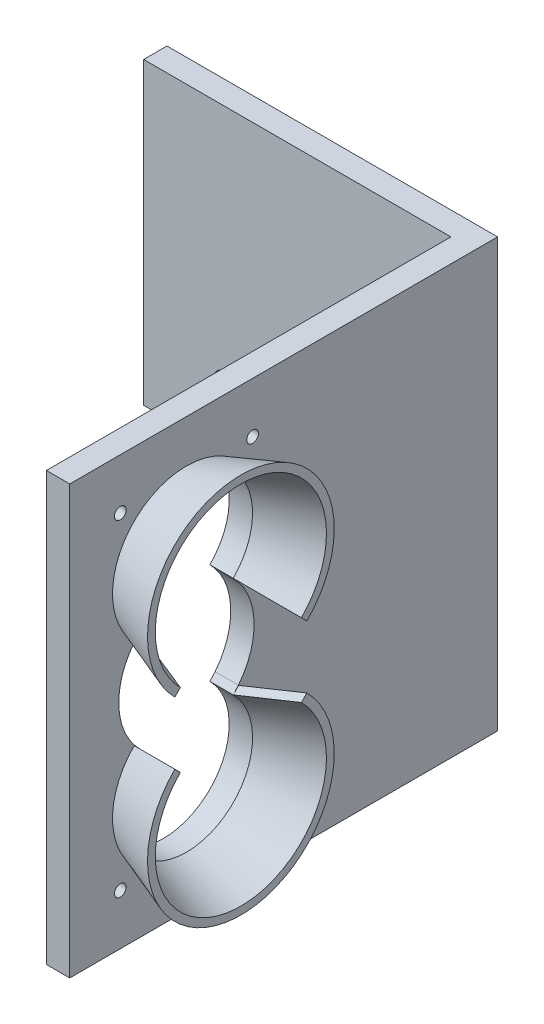
ISO-10303-21;
HEADER;
FILE_DESCRIPTION(('STEP AP214'),'2;1');
FILE_NAME('part.step','',(''),(''),'','','');
FILE_SCHEMA(('AUTOMOTIVE_DESIGN { 1 0 10303 214 1 1 1 1 }'));
ENDSEC;
DATA;
#1=APPLICATION_CONTEXT('core data for automotive mechanical design processes');
#2=APPLICATION_PROTOCOL_DEFINITION('international standard','automotive_design',2000,#1);
#3=PRODUCT_CONTEXT('',#1,'mechanical');
#4=PRODUCT('Part','Part','',(#3));
#5=PRODUCT_RELATED_PRODUCT_CATEGORY('part','',(#4));
#6=PRODUCT_DEFINITION_FORMATION('','',#4);
#7=PRODUCT_DEFINITION_CONTEXT('part definition',#1,'design');
#8=PRODUCT_DEFINITION('design','',#6,#7);
#9=PRODUCT_DEFINITION_SHAPE('','',#8);
#10=(LENGTH_UNIT() NAMED_UNIT(*) SI_UNIT(.MILLI.,.METRE.));
#11=(NAMED_UNIT(*) PLANE_ANGLE_UNIT() SI_UNIT($,.RADIAN.));
#12=(NAMED_UNIT(*) SI_UNIT($,.STERADIAN.) SOLID_ANGLE_UNIT());
#13=UNCERTAINTY_MEASURE_WITH_UNIT(LENGTH_MEASURE(1.E-05),#10,'distance_accuracy_value','');
#14=(GEOMETRIC_REPRESENTATION_CONTEXT(3) GLOBAL_UNCERTAINTY_ASSIGNED_CONTEXT((#13)) GLOBAL_UNIT_ASSIGNED_CONTEXT((#10,
#11,#12)) REPRESENTATION_CONTEXT('',''));
#15=CARTESIAN_POINT('',(0.,0.,0.));
#16=DIRECTION('',(0.,0.,1.));
#17=DIRECTION('',(1.,0.,0.));
#18=AXIS2_PLACEMENT_3D('',#15,#16,#17);
#19=CARTESIAN_POINT('',(25.8823529411765,27.5,-27.2843137254902));
#20=DIRECTION('',(-1.,0.,0.));
#21=DIRECTION('',(0.,0.,1.));
#22=AXIS2_PLACEMENT_3D('',#19,#20,#21);
#23=PLANE('',#22);
#24=CARTESIAN_POINT('',(25.8823529411765,21.,21.2156862745098));
#25=DIRECTION('',(1.,0.,0.));
#26=DIRECTION('',(0.,0.,-1.));
#27=AXIS2_PLACEMENT_3D('',#24,#25,#26);
#28=CIRCLE('',#27,0.750000000000002);
#29=CARTESIAN_POINT('',(25.8823529411765,21.,20.4656862745098));
#30=VERTEX_POINT('',#29);
#31=EDGE_CURVE('E521',#30,#30,#28,.T.);
#32=ORIENTED_EDGE('',*,*,#31,.F.);
#33=EDGE_LOOP('',(#32));
#34=FACE_BOUND('',#33,.T.);
#35=CARTESIAN_POINT('',(25.8823529411765,21.,4.2156862745098));
#36=DIRECTION('',(1.,0.,0.));
#37=DIRECTION('',(0.,0.,-1.));
#38=AXIS2_PLACEMENT_3D('',#35,#36,#37);
#39=CIRCLE('',#38,0.75);
#40=CARTESIAN_POINT('',(25.8823529411765,21.,3.4656862745098));
#41=VERTEX_POINT('',#40);
#42=EDGE_CURVE('E500',#41,#41,#39,.F.);
#43=ORIENTED_EDGE('',*,*,#42,.T.);
#44=EDGE_LOOP('',(#43));
#45=FACE_BOUND('',#44,.T.);
#46=CARTESIAN_POINT('',(25.8823529411765,-21.,21.2156862745098));
#47=DIRECTION('',(1.,0.,0.));
#48=DIRECTION('',(0.,0.,-1.));
#49=AXIS2_PLACEMENT_3D('',#46,#47,#48);
#50=CIRCLE('',#49,0.750000000000002);
#51=CARTESIAN_POINT('',(25.8823529411765,-21.,20.4656862745098));
#52=VERTEX_POINT('',#51);
#53=EDGE_CURVE('E336',#52,#52,#50,.F.);
#54=ORIENTED_EDGE('',*,*,#53,.T.);
#55=EDGE_LOOP('',(#54));
#56=FACE_BOUND('',#55,.T.);
#57=DIRECTION('',(0.,0.,-1.));
#58=VECTOR('',#57,1.);
#59=CARTESIAN_POINT('',(25.8823529411765,-27.5,-27.2843137254902));
#60=LINE('',#59,#58);
#61=CARTESIAN_POINT('',(25.8823529411765,-27.5,27.7156862745098));
#62=VERTEX_POINT('',#61);
#63=CARTESIAN_POINT('',(25.8823529411765,-27.5,-27.2843137254902));
#64=VERTEX_POINT('',#63);
#65=EDGE_CURVE('E333',#62,#64,#60,.T.);
#66=ORIENTED_EDGE('',*,*,#65,.T.);
#67=DIRECTION('',(0.,-1.,0.));
#68=VECTOR('',#67,1.);
#69=CARTESIAN_POINT('',(25.8823529411765,27.5,-27.2843137254902));
#70=LINE('',#69,#68);
#71=CARTESIAN_POINT('',(25.8823529411765,27.5,-27.2843137254902));
#72=VERTEX_POINT('',#71);
#73=EDGE_CURVE('E354',#72,#64,#70,.T.);
#74=ORIENTED_EDGE('',*,*,#73,.F.);
#75=DIRECTION('',(0.,0.,-1.));
#76=VECTOR('',#75,1.);
#77=CARTESIAN_POINT('',(25.8823529411765,27.5,-27.2843137254902));
#78=LINE('',#77,#76);
#79=CARTESIAN_POINT('',(25.8823529411765,27.5,27.7156862745098));
#80=VERTEX_POINT('',#79);
#81=EDGE_CURVE('E342',#80,#72,#78,.T.);
#82=ORIENTED_EDGE('',*,*,#81,.F.);
#83=DIRECTION('',(0.,-1.,0.));
#84=VECTOR('',#83,1.);
#85=CARTESIAN_POINT('',(25.8823529411765,27.5,27.7156862745098));
#86=LINE('',#85,#84);
#87=EDGE_CURVE('E357',#80,#62,#86,.T.);
#88=ORIENTED_EDGE('',*,*,#87,.T.);
#89=EDGE_LOOP('',(#66,#74,#82,#88));
#90=FACE_BOUND('',#89,.T.);
#91=CARTESIAN_POINT('',(25.8823529411765,-21.,4.2156862745098));
#92=DIRECTION('',(1.,0.,0.));
#93=DIRECTION('',(0.,0.,-1.));
#94=AXIS2_PLACEMENT_3D('',#91,#92,#93);
#95=CIRCLE('',#94,0.75);
#96=CARTESIAN_POINT('',(25.8823529411765,-21.,3.4656862745098));
#97=VERTEX_POINT('',#96);
#98=EDGE_CURVE('E527',#97,#97,#95,.T.);
#99=ORIENTED_EDGE('',*,*,#98,.F.);
#100=EDGE_LOOP('',(#99));
#101=FACE_BOUND('',#100,.T.);
#102=CARTESIAN_POINT('',(25.8823529411765,-12.5,12.7156862745098));
#103=DIRECTION('',(-1.,0.,0.));
#104=DIRECTION('',(0.,-1.,0.));
#105=AXIS2_PLACEMENT_3D('',#102,#103,#104);
#106=CIRCLE('',#105,9.5);
#107=CARTESIAN_POINT('',(25.8823529411765,-5.78248557872775,5.99817185323764));
#108=VERTEX_POINT('',#107);
#109=CARTESIAN_POINT('',(25.8823529411765,-5.78248557872776,19.433200695782));
#110=VERTEX_POINT('',#109);
#111=EDGE_CURVE('E435',#108,#110,#106,.T.);
#112=ORIENTED_EDGE('',*,*,#111,.T.);
#113=DIRECTION('',(0.,0.707106781186551,0.707106781186544));
#114=VECTOR('',#113,1.);
#115=CARTESIAN_POINT('',(25.8823529411765,-21.3388347648319,3.87685150967801));
#116=LINE('',#115,#114);
#117=CARTESIAN_POINT('',(25.8823529411765,-6.48959235991431,18.7260939145954));
#118=VERTEX_POINT('',#117);
#119=EDGE_CURVE('E395',#118,#110,#116,.T.);
#120=ORIENTED_EDGE('',*,*,#119,.F.);
#121=DIRECTION('',(0.,0.744628434388798,0.667479209189086));
#122=VECTOR('',#121,1.);
#123=CARTESIAN_POINT('',(25.8823529411765,-12.1986163895243,13.6085686247462));
#124=LINE('',#123,#122);
#125=CARTESIAN_POINT('',(25.8823529411765,-5.74397055779098,19.3944635709919));
#126=VERTEX_POINT('',#125);
#127=EDGE_CURVE('E454',#118,#126,#124,.T.);
#128=ORIENTED_EDGE('',*,*,#127,.T.);
#129=CARTESIAN_POINT('',(25.8823529411765,1.196959198424E-13,12.236501554681));
#130=DIRECTION('',(1.,0.,0.));
#131=DIRECTION('',(0.,0.,-1.));
#132=AXIS2_PLACEMENT_3D('',#129,#130,#131);
#133=CIRCLE('',#132,9.17766952966388);
#134=CARTESIAN_POINT('',(25.8823529411765,5.74397055779107,19.394463570992));
#135=VERTEX_POINT('',#134);
#136=EDGE_CURVE('E458',#135,#126,#133,.T.);
#137=ORIENTED_EDGE('',*,*,#136,.F.);
#138=DIRECTION('',(0.,-0.744628434388801,0.667479209189083));
#139=VECTOR('',#138,1.);
#140=CARTESIAN_POINT('',(25.8823529411765,12.1986163895244,13.6085686247464));
#141=LINE('',#140,#139);
#142=CARTESIAN_POINT('',(25.8823529411765,6.48959235991446,18.7260939145956));
#143=VERTEX_POINT('',#142);
#144=EDGE_CURVE('E493',#143,#135,#141,.T.);
#145=ORIENTED_EDGE('',*,*,#144,.F.);
#146=DIRECTION('',(0.,-0.707106781186551,0.707106781186544));
#147=VECTOR('',#146,1.);
#148=CARTESIAN_POINT('',(25.8823529411765,21.3388347648319,3.87685150967803));
#149=LINE('',#148,#147);
#150=CARTESIAN_POINT('',(25.8823529411765,5.78248557872775,19.433200695782));
#151=VERTEX_POINT('',#150);
#152=EDGE_CURVE('E411',#143,#151,#149,.T.);
#153=ORIENTED_EDGE('',*,*,#152,.T.);
#154=CARTESIAN_POINT('',(25.8823529411765,12.5,12.7156862745098));
#155=DIRECTION('',(1.,0.,0.));
#156=DIRECTION('',(0.,1.,0.));
#157=AXIS2_PLACEMENT_3D('',#154,#155,#156);
#158=CIRCLE('',#157,9.5);
#159=CARTESIAN_POINT('',(25.8823529411765,5.78248557872775,5.99817185323764));
#160=VERTEX_POINT('',#159);
#161=EDGE_CURVE('E172',#160,#151,#158,.T.);
#162=ORIENTED_EDGE('',*,*,#161,.F.);
#163=DIRECTION('',(0.,-0.707106781186551,-0.707106781186544));
#164=VECTOR('',#163,1.);
#165=CARTESIAN_POINT('',(25.8823529411765,21.3388347648319,21.5545210393416));
#166=LINE('',#165,#164);
#167=CARTESIAN_POINT('',(25.8823529411765,6.48959235991431,6.70527863442419));
#168=VERTEX_POINT('',#167);
#169=EDGE_CURVE('E437',#168,#160,#166,.T.);
#170=ORIENTED_EDGE('',*,*,#169,.F.);
#171=DIRECTION('',(0.,-0.744628434388708,-0.667479209189186));
#172=VECTOR('',#171,1.);
#173=CARTESIAN_POINT('',(25.8823529411765,-0.441386082781654,0.492402794361063));
#174=LINE('',#173,#172);
#175=CARTESIAN_POINT('',(25.8823529411765,5.74397055779077,6.03690897802791));
#176=VERTEX_POINT('',#175);
#177=EDGE_CURVE('E488',#168,#176,#174,.T.);
#178=ORIENTED_EDGE('',*,*,#177,.T.);
#179=CARTESIAN_POINT('',(25.8823529411765,0.,13.1948709943384));
#180=DIRECTION('',(1.,0.,0.));
#181=DIRECTION('',(0.,0.,-1.));
#182=AXIS2_PLACEMENT_3D('',#179,#180,#181);
#183=CIRCLE('',#182,9.17766952966349);
#184=CARTESIAN_POINT('',(25.8823529411765,-5.74397055779096,6.03690897802772));
#185=VERTEX_POINT('',#184);
#186=EDGE_CURVE('E485',#176,#185,#183,.F.);
#187=ORIENTED_EDGE('',*,*,#186,.T.);
#188=DIRECTION('',(0.,0.744628434388815,-0.667479209189067));
#189=VECTOR('',#188,1.);
#190=CARTESIAN_POINT('',(25.8823529411765,0.441386082782281,0.49240279436192));
#191=LINE('',#190,#189);
#192=CARTESIAN_POINT('',(25.8823529411765,-6.48959235991435,6.70527863442414));
#193=VERTEX_POINT('',#192);
#194=EDGE_CURVE('E482',#193,#185,#191,.T.);
#195=ORIENTED_EDGE('',*,*,#194,.F.);
#196=DIRECTION('',(0.,0.707106781186551,-0.707106781186544));
#197=VECTOR('',#196,1.);
#198=CARTESIAN_POINT('',(25.8823529411765,-21.3388347648319,21.5545210393416));
#199=LINE('',#198,#197);
#200=EDGE_CURVE('E421',#193,#108,#199,.T.);
#201=ORIENTED_EDGE('',*,*,#200,.T.);
#202=EDGE_LOOP('',(#112,#120,#128,#137,#145,#153,#162,#170,#178,#187,#195,#201));
#203=FACE_BOUND('',#202,.T.);
#204=ADVANCED_FACE('F149',(#34,#45,#56,#90,#101,#203),#23,.F.);
#205=CARTESIAN_POINT('',(22.8823529411765,27.5,27.7156862745098));
#206=DIRECTION('',(1.,0.,0.));
#207=DIRECTION('',(0.,0.,-1.));
#208=AXIS2_PLACEMENT_3D('',#205,#206,#207);
#209=PLANE('',#208);
#210=CARTESIAN_POINT('',(22.8823529411765,21.,21.2156862745098));
#211=DIRECTION('',(1.,0.,0.));
#212=DIRECTION('',(0.,0.,-1.));
#213=AXIS2_PLACEMENT_3D('',#210,#211,#212);
#214=CIRCLE('',#213,0.750000000000002);
#215=CARTESIAN_POINT('',(22.8823529411765,21.,20.4656862745098));
#216=VERTEX_POINT('',#215);
#217=EDGE_CURVE('E530',#216,#216,#214,.T.);
#218=ORIENTED_EDGE('',*,*,#217,.T.);
#219=EDGE_LOOP('',(#218));
#220=FACE_BOUND('',#219,.T.);
#221=DIRECTION('',(0.,0.744628434388798,0.667479209189086));
#222=VECTOR('',#221,1.);
#223=CARTESIAN_POINT('',(22.8823529411765,-12.1986163895243,13.6085686247462));
#224=LINE('',#223,#222);
#225=CARTESIAN_POINT('',(22.8823529411765,-6.48959235991436,18.7260939145955));
#226=VERTEX_POINT('',#225);
#227=CARTESIAN_POINT('',(22.8823529411765,-5.74397055779098,19.3944635709919));
#228=VERTEX_POINT('',#227);
#229=EDGE_CURVE('E455',#226,#228,#224,.T.);
#230=ORIENTED_EDGE('',*,*,#229,.F.);
#231=CARTESIAN_POINT('',(22.8823529411765,-12.5,12.7156862745098));
#232=DIRECTION('',(1.,0.,0.));
#233=DIRECTION('',(0.,0.,-1.));
#234=AXIS2_PLACEMENT_3D('',#231,#232,#233);
#235=CIRCLE('',#234,8.5);
#236=CARTESIAN_POINT('',(22.8823529411765,-6.48959235991435,6.70527863442414));
#237=VERTEX_POINT('',#236);
#238=EDGE_CURVE('E457',#226,#237,#235,.T.);
#239=ORIENTED_EDGE('',*,*,#238,.T.);
#240=DIRECTION('',(0.,0.744628434388815,-0.667479209189067));
#241=VECTOR('',#240,1.);
#242=CARTESIAN_POINT('',(22.8823529411765,0.441386082782281,0.49240279436192));
#243=LINE('',#242,#241);
#244=CARTESIAN_POINT('',(22.8823529411765,-5.74397055779096,6.03690897802772));
#245=VERTEX_POINT('',#244);
#246=EDGE_CURVE('E461',#237,#245,#243,.T.);
#247=ORIENTED_EDGE('',*,*,#246,.T.);
#248=CARTESIAN_POINT('',(22.8823529411765,0.,13.1948709943384));
#249=DIRECTION('',(1.,0.,0.));
#250=DIRECTION('',(0.,0.,-1.));
#251=AXIS2_PLACEMENT_3D('',#248,#249,#250);
#252=CIRCLE('',#251,9.17766952966349);
#253=CARTESIAN_POINT('',(22.8823529411765,5.74397055779077,6.03690897802791));
#254=VERTEX_POINT('',#253);
#255=EDGE_CURVE('E464',#254,#245,#252,.F.);
#256=ORIENTED_EDGE('',*,*,#255,.F.);
#257=DIRECTION('',(0.,-0.744628434388708,-0.667479209189186));
#258=VECTOR('',#257,1.);
#259=CARTESIAN_POINT('',(22.8823529411765,-0.441386082781654,0.492402794361063));
#260=LINE('',#259,#258);
#261=CARTESIAN_POINT('',(22.8823529411765,6.48959235991406,6.70527863442445));
#262=VERTEX_POINT('',#261);
#263=EDGE_CURVE('E466',#262,#254,#260,.T.);
#264=ORIENTED_EDGE('',*,*,#263,.F.);
#265=CARTESIAN_POINT('',(22.8823529411765,12.5,12.7156862745098));
#266=DIRECTION('',(1.,0.,0.));
#267=DIRECTION('',(0.,0.,-1.));
#268=AXIS2_PLACEMENT_3D('',#265,#266,#267);
#269=CIRCLE('',#268,8.5);
#270=CARTESIAN_POINT('',(22.8823529411765,6.48959235991446,18.7260939145956));
#271=VERTEX_POINT('',#270);
#272=EDGE_CURVE('E468',#262,#271,#269,.T.);
#273=ORIENTED_EDGE('',*,*,#272,.T.);
#274=DIRECTION('',(0.,-0.744628434388801,0.667479209189083));
#275=VECTOR('',#274,1.);
#276=CARTESIAN_POINT('',(22.8823529411765,12.1986163895244,13.6085686247464));
#277=LINE('',#276,#275);
#278=CARTESIAN_POINT('',(22.8823529411765,5.74397055779107,19.394463570992));
#279=VERTEX_POINT('',#278);
#280=EDGE_CURVE('E471',#271,#279,#277,.T.);
#281=ORIENTED_EDGE('',*,*,#280,.T.);
#282=CARTESIAN_POINT('',(22.8823529411765,1.196959198424E-13,12.236501554681));
#283=DIRECTION('',(1.,0.,0.));
#284=DIRECTION('',(0.,0.,-1.));
#285=AXIS2_PLACEMENT_3D('',#282,#283,#284);
#286=CIRCLE('',#285,9.17766952966388);
#287=EDGE_CURVE('E474',#279,#228,#286,.T.);
#288=ORIENTED_EDGE('',*,*,#287,.T.);
#289=EDGE_LOOP('',(#230,#239,#247,#256,#264,#273,#281,#288));
#290=FACE_BOUND('',#289,.T.);
#291=CARTESIAN_POINT('',(22.8823529411765,21.,4.2156862745098));
#292=DIRECTION('',(1.,0.,0.));
#293=DIRECTION('',(0.,0.,-1.));
#294=AXIS2_PLACEMENT_3D('',#291,#292,#293);
#295=CIRCLE('',#294,0.75);
#296=CARTESIAN_POINT('',(22.8823529411765,21.,3.4656862745098));
#297=VERTEX_POINT('',#296);
#298=EDGE_CURVE('E518',#297,#297,#295,.F.);
#299=ORIENTED_EDGE('',*,*,#298,.F.);
#300=EDGE_LOOP('',(#299));
#301=FACE_BOUND('',#300,.T.);
#302=CARTESIAN_POINT('',(22.8823529411765,-21.,21.2156862745098));
#303=DIRECTION('',(1.,0.,0.));
#304=DIRECTION('',(0.,0.,-1.));
#305=AXIS2_PLACEMENT_3D('',#302,#303,#304);
#306=CIRCLE('',#305,0.750000000000002);
#307=CARTESIAN_POINT('',(22.8823529411765,-21.,20.4656862745098));
#308=VERTEX_POINT('',#307);
#309=EDGE_CURVE('E348',#308,#308,#306,.F.);
#310=ORIENTED_EDGE('',*,*,#309,.F.);
#311=EDGE_LOOP('',(#310));
#312=FACE_BOUND('',#311,.T.);
#313=DIRECTION('',(0.,0.,1.));
#314=VECTOR('',#313,1.);
#315=CARTESIAN_POINT('',(22.8823529411765,-27.5,27.7156862745098));
#316=LINE('',#315,#314);
#317=CARTESIAN_POINT('',(22.8823529411765,-27.5,-24.2843137254902));
#318=VERTEX_POINT('',#317);
#319=CARTESIAN_POINT('',(22.8823529411765,-27.5,27.7156862745098));
#320=VERTEX_POINT('',#319);
#321=EDGE_CURVE('E347',#318,#320,#316,.T.);
#322=ORIENTED_EDGE('',*,*,#321,.T.);
#323=DIRECTION('',(0.,-1.,0.));
#324=VECTOR('',#323,1.);
#325=CARTESIAN_POINT('',(22.8823529411765,27.5,27.7156862745098));
#326=LINE('',#325,#324);
#327=CARTESIAN_POINT('',(22.8823529411765,27.5,27.7156862745098));
#328=VERTEX_POINT('',#327);
#329=EDGE_CURVE('E360',#328,#320,#326,.T.);
#330=ORIENTED_EDGE('',*,*,#329,.F.);
#331=DIRECTION('',(0.,0.,1.));
#332=VECTOR('',#331,1.);
#333=CARTESIAN_POINT('',(22.8823529411765,27.5,27.7156862745098));
#334=LINE('',#333,#332);
#335=CARTESIAN_POINT('',(22.8823529411765,27.5,-24.2843137254902));
#336=VERTEX_POINT('',#335);
#337=EDGE_CURVE('E324',#336,#328,#334,.T.);
#338=ORIENTED_EDGE('',*,*,#337,.F.);
#339=DIRECTION('',(0.,-1.,0.));
#340=VECTOR('',#339,1.);
#341=CARTESIAN_POINT('',(22.8823529411765,27.5,-24.2843137254902));
#342=LINE('',#341,#340);
#343=EDGE_CURVE('E157',#336,#318,#342,.T.);
#344=ORIENTED_EDGE('',*,*,#343,.T.);
#345=EDGE_LOOP('',(#322,#330,#338,#344));
#346=FACE_BOUND('',#345,.T.);
#347=CARTESIAN_POINT('',(22.8823529411765,-21.,4.2156862745098));
#348=DIRECTION('',(1.,0.,0.));
#349=DIRECTION('',(0.,0.,-1.));
#350=AXIS2_PLACEMENT_3D('',#347,#348,#349);
#351=CIRCLE('',#350,0.75);
#352=CARTESIAN_POINT('',(22.8823529411765,-21.,3.4656862745098));
#353=VERTEX_POINT('',#352);
#354=EDGE_CURVE('E524',#353,#353,#351,.T.);
#355=ORIENTED_EDGE('',*,*,#354,.T.);
#356=EDGE_LOOP('',(#355));
#357=FACE_BOUND('',#356,.T.);
#358=ADVANCED_FACE('F364',(#220,#290,#301,#312,#346,#357),#209,.F.);
#359=CARTESIAN_POINT('',(-16.6176470588235,27.5,-24.2843137254902));
#360=DIRECTION('',(1.,0.,0.));
#361=DIRECTION('',(0.,0.,-1.));
#362=AXIS2_PLACEMENT_3D('',#359,#360,#361);
#363=PLANE('',#362);
#364=DIRECTION('',(0.,-1.,0.));
#365=VECTOR('',#364,1.);
#366=CARTESIAN_POINT('',(-16.6176470588235,27.5,-27.2843137254902));
#367=LINE('',#366,#365);
#368=CARTESIAN_POINT('',(-16.6176470588235,27.5,-27.2843137254902));
#369=VERTEX_POINT('',#368);
#370=CARTESIAN_POINT('',(-16.6176470588235,-11.,-27.2843137254902));
#371=VERTEX_POINT('',#370);
#372=EDGE_CURVE('E315',#369,#371,#367,.T.);
#373=ORIENTED_EDGE('',*,*,#372,.T.);
#374=DIRECTION('',(0.,0.,-1.));
#375=VECTOR('',#374,1.);
#376=CARTESIAN_POINT('',(-16.6176470588235,-11.,-24.2843137254902));
#377=LINE('',#376,#375);
#378=CARTESIAN_POINT('',(-16.6176470588235,-11.,-24.2843137254902));
#379=VERTEX_POINT('',#378);
#380=EDGE_CURVE('E302',#379,#371,#377,.T.);
#381=ORIENTED_EDGE('',*,*,#380,.F.);
#382=DIRECTION('',(0.,-1.,0.));
#383=VECTOR('',#382,1.);
#384=CARTESIAN_POINT('',(-16.6176470588235,27.5,-24.2843137254902));
#385=LINE('',#384,#383);
#386=CARTESIAN_POINT('',(-16.6176470588235,27.5,-24.2843137254902));
#387=VERTEX_POINT('',#386);
#388=EDGE_CURVE('E12',#387,#379,#385,.T.);
#389=ORIENTED_EDGE('',*,*,#388,.F.);
#390=DIRECTION('',(0.,0.,1.));
#391=VECTOR('',#390,1.);
#392=CARTESIAN_POINT('',(-16.6176470588235,27.5,-24.2843137254902));
#393=LINE('',#392,#391);
#394=EDGE_CURVE('E325',#369,#387,#393,.T.);
#395=ORIENTED_EDGE('',*,*,#394,.F.);
#396=EDGE_LOOP('',(#373,#381,#389,#395));
#397=FACE_BOUND('',#396,.T.);
#398=ADVANCED_FACE('F151',(#397),#363,.F.);
#399=CARTESIAN_POINT('',(22.8823529411765,27.5,-24.2843137254902));
#400=DIRECTION('',(0.,0.,-1.));
#401=DIRECTION('',(-1.,0.,0.));
#402=AXIS2_PLACEMENT_3D('',#399,#400,#401);
#403=PLANE('',#402);
#404=CARTESIAN_POINT('',(13.8823529411765,-3.5,-24.2843137254902));
#405=DIRECTION('',(0.,0.,-1.));
#406=DIRECTION('',(-1.,0.,0.));
#407=AXIS2_PLACEMENT_3D('',#404,#405,#406);
#408=CIRCLE('',#407,1.5);
#409=CARTESIAN_POINT('',(12.3823529411765,-3.5,-24.2843137254902));
#410=VERTEX_POINT('',#409);
#411=EDGE_CURVE('E399',#410,#410,#408,.T.);
#412=ORIENTED_EDGE('',*,*,#411,.T.);
#413=EDGE_LOOP('',(#412));
#414=FACE_BOUND('',#413,.T.);
#415=CARTESIAN_POINT('',(-6.11764705882352,-3.5,-24.2843137254902));
#416=DIRECTION('',(0.,0.,-1.));
#417=DIRECTION('',(-1.,0.,0.));
#418=AXIS2_PLACEMENT_3D('',#415,#416,#417);
#419=CIRCLE('',#418,1.5);
#420=CARTESIAN_POINT('',(-7.61764705882352,-3.5,-24.2843137254902));
#421=VERTEX_POINT('',#420);
#422=EDGE_CURVE('E392',#421,#421,#419,.T.);
#423=ORIENTED_EDGE('',*,*,#422,.T.);
#424=EDGE_LOOP('',(#423));
#425=FACE_BOUND('',#424,.T.);
#426=DIRECTION('',(1.,0.,0.));
#427=VECTOR('',#426,1.);
#428=CARTESIAN_POINT('',(0.,-11.,-24.2843137254902));
#429=LINE('',#428,#427);
#430=CARTESIAN_POINT('',(3.38235294117648,-11.,-24.2843137254902));
#431=VERTEX_POINT('',#430);
#432=EDGE_CURVE('E298',#379,#431,#429,.T.);
#433=ORIENTED_EDGE('',*,*,#432,.T.);
#434=DIRECTION('',(0.,-1.,0.));
#435=VECTOR('',#434,1.);
#436=CARTESIAN_POINT('',(3.38235294117649,0.,-24.2843137254902));
#437=LINE('',#436,#435);
#438=CARTESIAN_POINT('',(3.38235294117648,-27.5,-24.2843137254902));
#439=VERTEX_POINT('',#438);
#440=EDGE_CURVE('E308',#431,#439,#437,.T.);
#441=ORIENTED_EDGE('',*,*,#440,.T.);
#442=DIRECTION('',(1.,0.,0.));
#443=VECTOR('',#442,1.);
#444=CARTESIAN_POINT('',(22.8823529411765,-27.5,-24.2843137254902));
#445=LINE('',#444,#443);
#446=EDGE_CURVE('E345',#439,#318,#445,.T.);
#447=ORIENTED_EDGE('',*,*,#446,.T.);
#448=ORIENTED_EDGE('',*,*,#343,.F.);
#449=DIRECTION('',(1.,0.,0.));
#450=VECTOR('',#449,1.);
#451=CARTESIAN_POINT('',(22.8823529411765,27.5,-24.2843137254902));
#452=LINE('',#451,#450);
#453=EDGE_CURVE('E319',#387,#336,#452,.T.);
#454=ORIENTED_EDGE('',*,*,#453,.F.);
#455=ORIENTED_EDGE('',*,*,#388,.T.);
#456=EDGE_LOOP('',(#433,#441,#447,#448,#454,#455));
#457=FACE_BOUND('',#456,.T.);
#458=ADVANCED_FACE('F317',(#414,#425,#457),#403,.F.);
#459=CARTESIAN_POINT('',(25.8823529411765,27.5,27.7156862745098));
#460=DIRECTION('',(0.,0.,-1.));
#461=DIRECTION('',(-1.,0.,0.));
#462=AXIS2_PLACEMENT_3D('',#459,#460,#461);
#463=PLANE('',#462);
#464=DIRECTION('',(1.,0.,0.));
#465=VECTOR('',#464,1.);
#466=CARTESIAN_POINT('',(25.8823529411765,-27.5,27.7156862745098));
#467=LINE('',#466,#465);
#468=EDGE_CURVE('E350',#320,#62,#467,.T.);
#469=ORIENTED_EDGE('',*,*,#468,.T.);
#470=ORIENTED_EDGE('',*,*,#87,.F.);
#471=DIRECTION('',(1.,0.,0.));
#472=VECTOR('',#471,1.);
#473=CARTESIAN_POINT('',(25.8823529411765,27.5,27.7156862745098));
#474=LINE('',#473,#472);
#475=EDGE_CURVE('E340',#328,#80,#474,.T.);
#476=ORIENTED_EDGE('',*,*,#475,.F.);
#477=ORIENTED_EDGE('',*,*,#329,.T.);
#478=EDGE_LOOP('',(#469,#470,#476,#477));
#479=FACE_BOUND('',#478,.T.);
#480=ADVANCED_FACE('F375',(#479),#463,.F.);
#481=CARTESIAN_POINT('',(-16.6176470588235,27.5,-27.2843137254902));
#482=DIRECTION('',(0.,0.,1.));
#483=DIRECTION('',(1.,0.,0.));
#484=AXIS2_PLACEMENT_3D('',#481,#482,#483);
#485=PLANE('',#484);
#486=CARTESIAN_POINT('',(13.8823529411765,-3.5,-27.2843137254902));
#487=DIRECTION('',(0.,0.,-1.));
#488=DIRECTION('',(-1.,0.,0.));
#489=AXIS2_PLACEMENT_3D('',#486,#487,#488);
#490=CIRCLE('',#489,1.5);
#491=CARTESIAN_POINT('',(12.3823529411765,-3.5,-27.2843137254902));
#492=VERTEX_POINT('',#491);
#493=EDGE_CURVE('E390',#492,#492,#490,.T.);
#494=ORIENTED_EDGE('',*,*,#493,.F.);
#495=EDGE_LOOP('',(#494));
#496=FACE_BOUND('',#495,.T.);
#497=CARTESIAN_POINT('',(-6.11764705882352,-3.5,-27.2843137254902));
#498=DIRECTION('',(0.,0.,-1.));
#499=DIRECTION('',(-1.,0.,0.));
#500=AXIS2_PLACEMENT_3D('',#497,#498,#499);
#501=CIRCLE('',#500,1.5);
#502=CARTESIAN_POINT('',(-7.61764705882352,-3.5,-27.2843137254902));
#503=VERTEX_POINT('',#502);
#504=EDGE_CURVE('E396',#503,#503,#501,.T.);
#505=ORIENTED_EDGE('',*,*,#504,.F.);
#506=EDGE_LOOP('',(#505));
#507=FACE_BOUND('',#506,.T.);
#508=DIRECTION('',(-1.,0.,0.));
#509=VECTOR('',#508,1.);
#510=CARTESIAN_POINT('',(-16.6176470588235,-27.5,-27.2843137254902));
#511=LINE('',#510,#509);
#512=CARTESIAN_POINT('',(3.38235294117649,-27.5,-27.2843137254902));
#513=VERTEX_POINT('',#512);
#514=EDGE_CURVE('E330',#64,#513,#511,.T.);
#515=ORIENTED_EDGE('',*,*,#514,.T.);
#516=DIRECTION('',(0.,-1.,0.));
#517=VECTOR('',#516,1.);
#518=CARTESIAN_POINT('',(3.38235294117649,0.,-27.2843137254902));
#519=LINE('',#518,#517);
#520=CARTESIAN_POINT('',(3.38235294117648,-11.,-27.2843137254902));
#521=VERTEX_POINT('',#520);
#522=EDGE_CURVE('E164',#521,#513,#519,.T.);
#523=ORIENTED_EDGE('',*,*,#522,.F.);
#524=DIRECTION('',(1.,0.,0.));
#525=VECTOR('',#524,1.);
#526=CARTESIAN_POINT('',(0.,-11.,-27.2843137254902));
#527=LINE('',#526,#525);
#528=EDGE_CURVE('E383',#371,#521,#527,.T.);
#529=ORIENTED_EDGE('',*,*,#528,.F.);
#530=ORIENTED_EDGE('',*,*,#372,.F.);
#531=DIRECTION('',(-1.,0.,0.));
#532=VECTOR('',#531,1.);
#533=CARTESIAN_POINT('',(-16.6176470588235,27.5,-27.2843137254902));
#534=LINE('',#533,#532);
#535=EDGE_CURVE('E329',#72,#369,#534,.T.);
#536=ORIENTED_EDGE('',*,*,#535,.F.);
#537=ORIENTED_EDGE('',*,*,#73,.T.);
#538=EDGE_LOOP('',(#515,#523,#529,#530,#536,#537));
#539=FACE_BOUND('',#538,.T.);
#540=ADVANCED_FACE('F382',(#496,#507,#539),#485,.F.);
#541=CARTESIAN_POINT('',(0.,27.5,0.));
#542=DIRECTION('',(0.,-1.,0.));
#543=DIRECTION('',(0.,0.,-1.));
#544=AXIS2_PLACEMENT_3D('',#541,#542,#543);
#545=PLANE('',#544);
#546=ORIENTED_EDGE('',*,*,#394,.T.);
#547=ORIENTED_EDGE('',*,*,#453,.T.);
#548=ORIENTED_EDGE('',*,*,#337,.T.);
#549=ORIENTED_EDGE('',*,*,#475,.T.);
#550=ORIENTED_EDGE('',*,*,#81,.T.);
#551=ORIENTED_EDGE('',*,*,#535,.T.);
#552=EDGE_LOOP('',(#546,#547,#548,#549,#550,#551));
#553=FACE_BOUND('',#552,.T.);
#554=ADVANCED_FACE('F327',(#553),#545,.F.);
#555=CARTESIAN_POINT('',(0.,-27.5,0.));
#556=DIRECTION('',(0.,-1.,0.));
#557=DIRECTION('',(0.,0.,-1.));
#558=AXIS2_PLACEMENT_3D('',#555,#556,#557);
#559=PLANE('',#558);
#560=DIRECTION('',(0.,0.,-1.));
#561=VECTOR('',#560,1.);
#562=CARTESIAN_POINT('',(3.38235294117648,-27.5,-24.2843137254902));
#563=LINE('',#562,#561);
#564=EDGE_CURVE('E388',#439,#513,#563,.T.);
#565=ORIENTED_EDGE('',*,*,#564,.T.);
#566=ORIENTED_EDGE('',*,*,#514,.F.);
#567=ORIENTED_EDGE('',*,*,#65,.F.);
#568=ORIENTED_EDGE('',*,*,#468,.F.);
#569=ORIENTED_EDGE('',*,*,#321,.F.);
#570=ORIENTED_EDGE('',*,*,#446,.F.);
#571=EDGE_LOOP('',(#565,#566,#567,#568,#569,#570));
#572=FACE_BOUND('',#571,.T.);
#573=ADVANCED_FACE('F370',(#572),#559,.T.);
#574=CARTESIAN_POINT('',(22.8823529411765,-21.,21.2156862745098));
#575=DIRECTION('',(1.,0.,0.));
#576=DIRECTION('',(0.,0.,-1.));
#577=AXIS2_PLACEMENT_3D('',#574,#575,#576);
#578=CYLINDRICAL_SURFACE('',#577,0.750000000000002);
#579=ORIENTED_EDGE('',*,*,#309,.T.);
#580=EDGE_LOOP('',(#579));
#581=FACE_BOUND('',#580,.T.);
#582=ORIENTED_EDGE('',*,*,#53,.F.);
#583=EDGE_LOOP('',(#582));
#584=FACE_BOUND('',#583,.T.);
#585=ADVANCED_FACE('F541',(#581,#584),#578,.F.);
#586=CARTESIAN_POINT('',(22.8823529411765,21.,4.2156862745098));
#587=DIRECTION('',(1.,0.,0.));
#588=DIRECTION('',(0.,0.,-1.));
#589=AXIS2_PLACEMENT_3D('',#586,#587,#588);
#590=CYLINDRICAL_SURFACE('',#589,0.75);
#591=ORIENTED_EDGE('',*,*,#298,.T.);
#592=EDGE_LOOP('',(#591));
#593=FACE_BOUND('',#592,.T.);
#594=ORIENTED_EDGE('',*,*,#42,.F.);
#595=EDGE_LOOP('',(#594));
#596=FACE_BOUND('',#595,.T.);
#597=ADVANCED_FACE('F543',(#593,#596),#590,.F.);
#598=CARTESIAN_POINT('',(22.8823529411765,-12.1986163895243,13.6085686247462));
#599=DIRECTION('',(0.,0.667479209189086,-0.744628434388798));
#600=DIRECTION('',(0.,0.744628434388798,0.667479209189086));
#601=AXIS2_PLACEMENT_3D('',#598,#599,#600);
#602=PLANE('',#601);
#603=ORIENTED_EDGE('',*,*,#127,.F.);
#604=DIRECTION('',(1.,0.,0.));
#605=VECTOR('',#604,1.);
#606=CARTESIAN_POINT('',(22.8823529411765,-6.48959235991436,18.7260939145955));
#607=LINE('',#606,#605);
#608=EDGE_CURVE('E477',#226,#118,#607,.T.);
#609=ORIENTED_EDGE('',*,*,#608,.F.);
#610=ORIENTED_EDGE('',*,*,#229,.T.);
#611=DIRECTION('',(1.,0.,0.));
#612=VECTOR('',#611,1.);
#613=CARTESIAN_POINT('',(22.8823529411765,-5.74397055779098,19.3944635709919));
#614=LINE('',#613,#612);
#615=EDGE_CURVE('E498',#228,#126,#614,.T.);
#616=ORIENTED_EDGE('',*,*,#615,.T.);
#617=EDGE_LOOP('',(#603,#609,#610,#616));
#618=FACE_BOUND('',#617,.T.);
#619=ADVANCED_FACE('F549',(#618),#602,.T.);
#620=CARTESIAN_POINT('',(22.8823529411765,1.196959198424E-13,12.236501554681));
#621=DIRECTION('',(1.,0.,0.));
#622=DIRECTION('',(0.,0.,-1.));
#623=AXIS2_PLACEMENT_3D('',#620,#621,#622);
#624=CYLINDRICAL_SURFACE('',#623,9.17766952966388);
#625=ORIENTED_EDGE('',*,*,#136,.T.);
#626=ORIENTED_EDGE('',*,*,#615,.F.);
#627=ORIENTED_EDGE('',*,*,#287,.F.);
#628=DIRECTION('',(1.,0.,0.));
#629=VECTOR('',#628,1.);
#630=CARTESIAN_POINT('',(22.8823529411765,5.74397055779107,19.394463570992));
#631=LINE('',#630,#629);
#632=EDGE_CURVE('E501',#279,#135,#631,.T.);
#633=ORIENTED_EDGE('',*,*,#632,.T.);
#634=EDGE_LOOP('',(#625,#626,#627,#633));
#635=FACE_BOUND('',#634,.T.);
#636=ADVANCED_FACE('F646',(#635),#624,.F.);
#637=CARTESIAN_POINT('',(22.8823529411765,12.1986163895244,13.6085686247464));
#638=DIRECTION('',(0.,0.667479209189082,0.744628434388801));
#639=DIRECTION('',(0.,-0.744628434388801,0.667479209189083));
#640=AXIS2_PLACEMENT_3D('',#637,#638,#639);
#641=PLANE('',#640);
#642=ORIENTED_EDGE('',*,*,#144,.T.);
#643=ORIENTED_EDGE('',*,*,#632,.F.);
#644=ORIENTED_EDGE('',*,*,#280,.F.);
#645=DIRECTION('',(1.,0.,0.));
#646=VECTOR('',#645,1.);
#647=CARTESIAN_POINT('',(22.8823529411765,6.48959235991446,18.7260939145956));
#648=LINE('',#647,#646);
#649=EDGE_CURVE('E503',#271,#143,#648,.T.);
#650=ORIENTED_EDGE('',*,*,#649,.T.);
#651=EDGE_LOOP('',(#642,#643,#644,#650));
#652=FACE_BOUND('',#651,.T.);
#653=ADVANCED_FACE('F649',(#652),#641,.F.);
#654=CARTESIAN_POINT('',(22.8823529411765,12.5,12.7156862745098));
#655=DIRECTION('',(1.,0.,0.));
#656=DIRECTION('',(0.,0.,-1.));
#657=AXIS2_PLACEMENT_3D('',#654,#655,#656);
#658=CYLINDRICAL_SURFACE('',#657,8.5);
#659=CARTESIAN_POINT('',(25.8823529411765,12.5,12.7156862745098));
#660=DIRECTION('',(1.,0.,0.));
#661=DIRECTION('',(0.,0.,-1.));
#662=AXIS2_PLACEMENT_3D('',#659,#660,#661);
#663=CIRCLE('',#662,8.5);
#664=EDGE_CURVE('E491',#168,#143,#663,.T.);
#665=ORIENTED_EDGE('',*,*,#664,.T.);
#666=ORIENTED_EDGE('',*,*,#649,.F.);
#667=ORIENTED_EDGE('',*,*,#272,.F.);
#668=DIRECTION('',(1.,0.,0.));
#669=VECTOR('',#668,1.);
#670=CARTESIAN_POINT('',(22.8823529411765,6.48959235991406,6.70527863442445));
#671=LINE('',#670,#669);
#672=EDGE_CURVE('E506',#262,#168,#671,.T.);
#673=ORIENTED_EDGE('',*,*,#672,.T.);
#674=EDGE_LOOP('',(#665,#666,#667,#673));
#675=FACE_BOUND('',#674,.T.);
#676=ADVANCED_FACE('F653',(#675),#658,.F.);
#677=CARTESIAN_POINT('',(22.8823529411765,-0.441386082781654,0.492402794361063));
#678=DIRECTION('',(0.,-0.667479209189186,0.744628434388708));
#679=DIRECTION('',(0.,-0.744628434388708,-0.667479209189186));
#680=AXIS2_PLACEMENT_3D('',#677,#678,#679);
#681=PLANE('',#680);
#682=ORIENTED_EDGE('',*,*,#177,.F.);
#683=ORIENTED_EDGE('',*,*,#672,.F.);
#684=ORIENTED_EDGE('',*,*,#263,.T.);
#685=DIRECTION('',(1.,0.,0.));
#686=VECTOR('',#685,1.);
#687=CARTESIAN_POINT('',(22.8823529411765,5.74397055779077,6.03690897802791));
#688=LINE('',#687,#686);
#689=EDGE_CURVE('E509',#254,#176,#688,.T.);
#690=ORIENTED_EDGE('',*,*,#689,.T.);
#691=EDGE_LOOP('',(#682,#683,#684,#690));
#692=FACE_BOUND('',#691,.T.);
#693=ADVANCED_FACE('F657',(#692),#681,.T.);
#694=CARTESIAN_POINT('',(22.8823529411765,0.,13.1948709943384));
#695=DIRECTION('',(1.,0.,0.));
#696=DIRECTION('',(0.,0.,-1.));
#697=AXIS2_PLACEMENT_3D('',#694,#695,#696);
#698=CYLINDRICAL_SURFACE('',#697,9.17766952966349);
#699=ORIENTED_EDGE('',*,*,#186,.F.);
#700=ORIENTED_EDGE('',*,*,#689,.F.);
#701=ORIENTED_EDGE('',*,*,#255,.T.);
#702=DIRECTION('',(1.,0.,0.));
#703=VECTOR('',#702,1.);
#704=CARTESIAN_POINT('',(22.8823529411765,-5.74397055779096,6.03690897802772));
#705=LINE('',#704,#703);
#706=EDGE_CURVE('E511',#245,#185,#705,.T.);
#707=ORIENTED_EDGE('',*,*,#706,.T.);
#708=EDGE_LOOP('',(#699,#700,#701,#707));
#709=FACE_BOUND('',#708,.T.);
#710=ADVANCED_FACE('F661',(#709),#698,.F.);
#711=CARTESIAN_POINT('',(22.8823529411765,0.441386082782281,0.49240279436192));
#712=DIRECTION('',(0.,-0.667479209189067,-0.744628434388815));
#713=DIRECTION('',(0.,0.744628434388815,-0.667479209189067));
#714=AXIS2_PLACEMENT_3D('',#711,#712,#713);
#715=PLANE('',#714);
#716=ORIENTED_EDGE('',*,*,#194,.T.);
#717=ORIENTED_EDGE('',*,*,#706,.F.);
#718=ORIENTED_EDGE('',*,*,#246,.F.);
#719=DIRECTION('',(1.,0.,0.));
#720=VECTOR('',#719,1.);
#721=CARTESIAN_POINT('',(22.8823529411765,-6.48959235991435,6.70527863442414));
#722=LINE('',#721,#720);
#723=EDGE_CURVE('E513',#237,#193,#722,.T.);
#724=ORIENTED_EDGE('',*,*,#723,.T.);
#725=EDGE_LOOP('',(#716,#717,#718,#724));
#726=FACE_BOUND('',#725,.T.);
#727=ADVANCED_FACE('F665',(#726),#715,.F.);
#728=CARTESIAN_POINT('',(22.8823529411765,-12.5,12.7156862745098));
#729=DIRECTION('',(1.,0.,0.));
#730=DIRECTION('',(0.,0.,-1.));
#731=AXIS2_PLACEMENT_3D('',#728,#729,#730);
#732=CYLINDRICAL_SURFACE('',#731,8.5);
#733=CARTESIAN_POINT('',(25.8823529411765,-12.5,12.7156862745098));
#734=DIRECTION('',(1.,0.,0.));
#735=DIRECTION('',(0.,0.,-1.));
#736=AXIS2_PLACEMENT_3D('',#733,#734,#735);
#737=CIRCLE('',#736,8.5);
#738=EDGE_CURVE('E480',#118,#193,#737,.T.);
#739=ORIENTED_EDGE('',*,*,#738,.T.);
#740=ORIENTED_EDGE('',*,*,#723,.F.);
#741=ORIENTED_EDGE('',*,*,#238,.F.);
#742=ORIENTED_EDGE('',*,*,#608,.T.);
#743=EDGE_LOOP('',(#739,#740,#741,#742));
#744=FACE_BOUND('',#743,.T.);
#745=ADVANCED_FACE('F669',(#744),#732,.F.);
#746=CARTESIAN_POINT('',(22.8823529411765,21.,21.2156862745098));
#747=DIRECTION('',(1.,0.,0.));
#748=DIRECTION('',(0.,0.,-1.));
#749=AXIS2_PLACEMENT_3D('',#746,#747,#748);
#750=CYLINDRICAL_SURFACE('',#749,0.750000000000002);
#751=ORIENTED_EDGE('',*,*,#217,.F.);
#752=EDGE_LOOP('',(#751));
#753=FACE_BOUND('',#752,.T.);
#754=ORIENTED_EDGE('',*,*,#31,.T.);
#755=EDGE_LOOP('',(#754));
#756=FACE_BOUND('',#755,.T.);
#757=ADVANCED_FACE('F673',(#753,#756),#750,.F.);
#758=CARTESIAN_POINT('',(22.8823529411765,-21.,4.2156862745098));
#759=DIRECTION('',(1.,0.,0.));
#760=DIRECTION('',(0.,0.,-1.));
#761=AXIS2_PLACEMENT_3D('',#758,#759,#760);
#762=CYLINDRICAL_SURFACE('',#761,0.75);
#763=ORIENTED_EDGE('',*,*,#354,.F.);
#764=EDGE_LOOP('',(#763));
#765=FACE_BOUND('',#764,.T.);
#766=ORIENTED_EDGE('',*,*,#98,.T.);
#767=EDGE_LOOP('',(#766));
#768=FACE_BOUND('',#767,.T.);
#769=ADVANCED_FACE('F645',(#765,#768),#762,.F.);
#770=CARTESIAN_POINT('',(25.8823529411765,12.5,12.7156862745098));
#771=DIRECTION('',(1.,0.,0.));
#772=DIRECTION('',(0.,1.,0.));
#773=AXIS2_PLACEMENT_3D('',#770,#771,#772);
#774=CONICAL_SURFACE('',#773,9.5,0.343023940420704);
#775=ORIENTED_EDGE('',*,*,#161,.T.);
#776=DIRECTION('',(0.941741911594837,-0.237825747077249,0.237825747077246));
#777=VECTOR('',#776,1.);
#778=CARTESIAN_POINT('',(-4.0404578120841,13.3391364343679,11.8765498401419));
#779=LINE('',#778,#777);
#780=CARTESIAN_POINT('',(32.8823529411765,4.01471862576137,21.2009676487483));
#781=VERTEX_POINT('',#780);
#782=EDGE_CURVE('E419',#151,#781,#779,.T.);
#783=ORIENTED_EDGE('',*,*,#782,.T.);
#784=CARTESIAN_POINT('',(32.8823529411765,12.5,12.7156862745098));
#785=DIRECTION('',(1.,0.,0.));
#786=DIRECTION('',(0.,1.,0.));
#787=AXIS2_PLACEMENT_3D('',#784,#785,#786);
#788=CIRCLE('',#787,12.);
#789=CARTESIAN_POINT('',(32.8823529411765,4.01471862576137,4.23040490027128));
#790=VERTEX_POINT('',#789);
#791=EDGE_CURVE('E451',#790,#781,#788,.T.);
#792=ORIENTED_EDGE('',*,*,#791,.F.);
#793=DIRECTION('',(0.941741911594837,-0.237825747077249,-0.237825747077246));
#794=VECTOR('',#793,1.);
#795=CARTESIAN_POINT('',(-4.0404578120841,13.3391364343679,13.5548227088777));
#796=LINE('',#795,#794);
#797=EDGE_CURVE('E446',#160,#790,#796,.T.);
#798=ORIENTED_EDGE('',*,*,#797,.F.);
#799=EDGE_LOOP('',(#775,#783,#792,#798));
#800=FACE_BOUND('',#799,.T.);
#801=ADVANCED_FACE('F641',(#800),#774,.T.);
#802=CARTESIAN_POINT('',(32.8823529411765,21.3388347648319,21.5545210393416));
#803=DIRECTION('',(1.,0.,0.));
#804=DIRECTION('',(0.,1.,0.));
#805=AXIS2_PLACEMENT_3D('',#802,#803,#804);
#806=PLANE('',#805);
#807=ORIENTED_EDGE('',*,*,#791,.T.);
#808=DIRECTION('',(0.,-0.707106781186551,0.707106781186544));
#809=VECTOR('',#808,1.);
#810=CARTESIAN_POINT('',(32.8823529411765,21.3388347648319,3.87685150967803));
#811=LINE('',#810,#809);
#812=CARTESIAN_POINT('',(32.8823529411765,4.72182540694792,20.4938608675618));
#813=VERTEX_POINT('',#812);
#814=EDGE_CURVE('E416',#813,#781,#811,.T.);
#815=ORIENTED_EDGE('',*,*,#814,.F.);
#816=CARTESIAN_POINT('',(32.8823529411765,12.5,12.7156862745098));
#817=DIRECTION('',(1.,0.,0.));
#818=DIRECTION('',(0.,1.,0.));
#819=AXIS2_PLACEMENT_3D('',#816,#817,#818);
#820=CIRCLE('',#819,11.);
#821=CARTESIAN_POINT('',(32.8823529411765,4.72182540694792,4.93751168145782));
#822=VERTEX_POINT('',#821);
#823=EDGE_CURVE('E449',#822,#813,#820,.T.);
#824=ORIENTED_EDGE('',*,*,#823,.F.);
#825=DIRECTION('',(0.,-0.707106781186551,-0.707106781186544));
#826=VECTOR('',#825,1.);
#827=CARTESIAN_POINT('',(32.8823529411765,21.3388347648319,21.5545210393416));
#828=LINE('',#827,#826);
#829=EDGE_CURVE('E443',#822,#790,#828,.T.);
#830=ORIENTED_EDGE('',*,*,#829,.T.);
#831=EDGE_LOOP('',(#807,#815,#824,#830));
#832=FACE_BOUND('',#831,.T.);
#833=ADVANCED_FACE('F637',(#832),#806,.T.);
#834=CARTESIAN_POINT('',(25.8823529411765,12.5,12.7156862745098));
#835=DIRECTION('',(1.,0.,0.));
#836=DIRECTION('',(0.,1.,0.));
#837=AXIS2_PLACEMENT_3D('',#834,#835,#836);
#838=CONICAL_SURFACE('',#837,8.49999999999999,0.343023940420704);
#839=ORIENTED_EDGE('',*,*,#823,.T.);
#840=DIRECTION('',(0.941741911594837,-0.23782574707725,0.237825747077247));
#841=VECTOR('',#840,1.);
#842=CARTESIAN_POINT('',(-3.72371573063614,13.9662537606691,11.2494325138407));
#843=LINE('',#842,#841);
#844=EDGE_CURVE('E413',#143,#813,#843,.T.);
#845=ORIENTED_EDGE('',*,*,#844,.F.);
#846=ORIENTED_EDGE('',*,*,#664,.F.);
#847=DIRECTION('',(0.941741911594837,-0.237825747077249,-0.237825747077247));
#848=VECTOR('',#847,1.);
#849=CARTESIAN_POINT('',(-3.72371573063614,13.9662537606691,14.1819400351789));
#850=LINE('',#849,#848);
#851=EDGE_CURVE('E440',#168,#822,#850,.T.);
#852=ORIENTED_EDGE('',*,*,#851,.T.);
#853=EDGE_LOOP('',(#839,#845,#846,#852));
#854=FACE_BOUND('',#853,.T.);
#855=ADVANCED_FACE('F633',(#854),#838,.F.);
#856=CARTESIAN_POINT('',(0.,21.3388347648319,21.5545210393416));
#857=DIRECTION('',(0.,0.707106781186544,-0.707106781186551));
#858=DIRECTION('',(0.,0.707106781186551,0.707106781186544));
#859=AXIS2_PLACEMENT_3D('',#856,#857,#858);
#860=PLANE('',#859);
#861=ORIENTED_EDGE('',*,*,#169,.T.);
#862=ORIENTED_EDGE('',*,*,#797,.T.);
#863=ORIENTED_EDGE('',*,*,#829,.F.);
#864=ORIENTED_EDGE('',*,*,#851,.F.);
#865=EDGE_LOOP('',(#861,#862,#863,#864));
#866=FACE_BOUND('',#865,.T.);
#867=ADVANCED_FACE('F629',(#866),#860,.F.);
#868=CARTESIAN_POINT('',(25.8823529411765,-12.5,12.7156862745098));
#869=DIRECTION('',(1.,0.,0.));
#870=DIRECTION('',(0.,-1.,0.));
#871=AXIS2_PLACEMENT_3D('',#868,#869,#870);
#872=CONICAL_SURFACE('',#871,9.5,0.343023940420704);
#873=CARTESIAN_POINT('',(32.8823529411765,-12.5,12.7156862745098));
#874=DIRECTION('',(-1.,0.,0.));
#875=DIRECTION('',(0.,-1.,0.));
#876=AXIS2_PLACEMENT_3D('',#873,#874,#875);
#877=CIRCLE('',#876,12.);
#878=CARTESIAN_POINT('',(32.8823529411765,-4.01471862576137,4.23040490027128));
#879=VERTEX_POINT('',#878);
#880=CARTESIAN_POINT('',(32.8823529411765,-4.01471862576137,21.2009676487483));
#881=VERTEX_POINT('',#880);
#882=EDGE_CURVE('E433',#879,#881,#877,.T.);
#883=ORIENTED_EDGE('',*,*,#882,.T.);
#884=DIRECTION('',(0.941741911594837,0.237825747077249,0.237825747077246));
#885=VECTOR('',#884,1.);
#886=CARTESIAN_POINT('',(-4.0404578120841,-13.3391364343679,11.8765498401419));
#887=LINE('',#886,#885);
#888=EDGE_CURVE('E408',#110,#881,#887,.T.);
#889=ORIENTED_EDGE('',*,*,#888,.F.);
#890=ORIENTED_EDGE('',*,*,#111,.F.);
#891=DIRECTION('',(0.941741911594837,0.237825747077249,-0.237825747077246));
#892=VECTOR('',#891,1.);
#893=CARTESIAN_POINT('',(-4.0404578120841,-13.3391364343679,13.5548227088777));
#894=LINE('',#893,#892);
#895=EDGE_CURVE('E428',#108,#879,#894,.T.);
#896=ORIENTED_EDGE('',*,*,#895,.T.);
#897=EDGE_LOOP('',(#883,#889,#890,#896));
#898=FACE_BOUND('',#897,.T.);
#899=ADVANCED_FACE('F625',(#898),#872,.T.);
#900=CARTESIAN_POINT('',(32.8823529411765,-21.3388347648319,21.5545210393416));
#901=DIRECTION('',(1.,0.,0.));
#902=DIRECTION('',(0.,-1.,0.));
#903=AXIS2_PLACEMENT_3D('',#900,#901,#902);
#904=PLANE('',#903);
#905=CARTESIAN_POINT('',(32.8823529411765,-12.5,12.7156862745098));
#906=DIRECTION('',(-1.,0.,0.));
#907=DIRECTION('',(0.,-1.,0.));
#908=AXIS2_PLACEMENT_3D('',#905,#906,#907);
#909=CIRCLE('',#908,11.);
#910=CARTESIAN_POINT('',(32.8823529411765,-4.72182540694792,4.93751168145782));
#911=VERTEX_POINT('',#910);
#912=CARTESIAN_POINT('',(32.8823529411765,-4.72182540694792,20.4938608675618));
#913=VERTEX_POINT('',#912);
#914=EDGE_CURVE('E431',#911,#913,#909,.T.);
#915=ORIENTED_EDGE('',*,*,#914,.T.);
#916=DIRECTION('',(0.,0.707106781186551,0.707106781186544));
#917=VECTOR('',#916,1.);
#918=CARTESIAN_POINT('',(32.8823529411765,-21.3388347648319,3.87685150967801));
#919=LINE('',#918,#917);
#920=EDGE_CURVE('E405',#913,#881,#919,.T.);
#921=ORIENTED_EDGE('',*,*,#920,.T.);
#922=ORIENTED_EDGE('',*,*,#882,.F.);
#923=DIRECTION('',(0.,0.707106781186551,-0.707106781186544));
#924=VECTOR('',#923,1.);
#925=CARTESIAN_POINT('',(32.8823529411765,-21.3388347648319,21.5545210393416));
#926=LINE('',#925,#924);
#927=EDGE_CURVE('E426',#911,#879,#926,.T.);
#928=ORIENTED_EDGE('',*,*,#927,.F.);
#929=EDGE_LOOP('',(#915,#921,#922,#928));
#930=FACE_BOUND('',#929,.T.);
#931=ADVANCED_FACE('F621',(#930),#904,.T.);
#932=CARTESIAN_POINT('',(25.8823529411765,-12.5,12.7156862745098));
#933=DIRECTION('',(1.,0.,0.));
#934=DIRECTION('',(0.,-1.,0.));
#935=AXIS2_PLACEMENT_3D('',#932,#933,#934);
#936=CONICAL_SURFACE('',#935,8.49999999999999,0.343023940420704);
#937=DIRECTION('',(0.941741911594837,0.237825747077249,-0.237825747077247));
#938=VECTOR('',#937,1.);
#939=CARTESIAN_POINT('',(-3.72371573063614,-13.9662537606691,14.1819400351789));
#940=LINE('',#939,#938);
#941=EDGE_CURVE('E424',#193,#911,#940,.T.);
#942=ORIENTED_EDGE('',*,*,#941,.F.);
#943=ORIENTED_EDGE('',*,*,#738,.F.);
#944=DIRECTION('',(0.941741911594837,0.237825747077249,0.237825747077247));
#945=VECTOR('',#944,1.);
#946=CARTESIAN_POINT('',(-3.72371573063614,-13.9662537606691,11.2494325138407));
#947=LINE('',#946,#945);
#948=EDGE_CURVE('E402',#118,#913,#947,.T.);
#949=ORIENTED_EDGE('',*,*,#948,.T.);
#950=ORIENTED_EDGE('',*,*,#914,.F.);
#951=EDGE_LOOP('',(#942,#943,#949,#950));
#952=FACE_BOUND('',#951,.T.);
#953=ADVANCED_FACE('F617',(#952),#936,.F.);
#954=CARTESIAN_POINT('',(0.,-21.3388347648319,21.5545210393416));
#955=DIRECTION('',(0.,-0.707106781186544,-0.707106781186551));
#956=DIRECTION('',(0.,-0.707106781186551,0.707106781186544));
#957=AXIS2_PLACEMENT_3D('',#954,#955,#956);
#958=PLANE('',#957);
#959=ORIENTED_EDGE('',*,*,#200,.F.);
#960=ORIENTED_EDGE('',*,*,#941,.T.);
#961=ORIENTED_EDGE('',*,*,#927,.T.);
#962=ORIENTED_EDGE('',*,*,#895,.F.);
#963=EDGE_LOOP('',(#959,#960,#961,#962));
#964=FACE_BOUND('',#963,.T.);
#965=ADVANCED_FACE('F613',(#964),#958,.F.);
#966=CARTESIAN_POINT('',(0.,21.3388347648319,3.87685150967802));
#967=DIRECTION('',(0.,0.707106781186544,0.707106781186551));
#968=DIRECTION('',(0.,0.707106781186551,-0.707106781186544));
#969=AXIS2_PLACEMENT_3D('',#966,#967,#968);
#970=PLANE('',#969);
#971=ORIENTED_EDGE('',*,*,#152,.F.);
#972=ORIENTED_EDGE('',*,*,#844,.T.);
#973=ORIENTED_EDGE('',*,*,#814,.T.);
#974=ORIENTED_EDGE('',*,*,#782,.F.);
#975=EDGE_LOOP('',(#971,#972,#973,#974));
#976=FACE_BOUND('',#975,.T.);
#977=ADVANCED_FACE('F609',(#976),#970,.F.);
#978=CARTESIAN_POINT('',(0.,-21.3388347648319,3.876851509678));
#979=DIRECTION('',(0.,-0.707106781186544,0.707106781186551));
#980=DIRECTION('',(0.,-0.707106781186551,-0.707106781186544));
#981=AXIS2_PLACEMENT_3D('',#978,#979,#980);
#982=PLANE('',#981);
#983=ORIENTED_EDGE('',*,*,#119,.T.);
#984=ORIENTED_EDGE('',*,*,#888,.T.);
#985=ORIENTED_EDGE('',*,*,#920,.F.);
#986=ORIENTED_EDGE('',*,*,#948,.F.);
#987=EDGE_LOOP('',(#983,#984,#985,#986));
#988=FACE_BOUND('',#987,.T.);
#989=ADVANCED_FACE('F604',(#988),#982,.F.);
#990=CARTESIAN_POINT('',(3.38235294117649,0.,-24.2843137254902));
#991=DIRECTION('',(1.,0.,0.));
#992=DIRECTION('',(0.,1.,0.));
#993=AXIS2_PLACEMENT_3D('',#990,#991,#992);
#994=PLANE('',#993);
#995=ORIENTED_EDGE('',*,*,#522,.T.);
#996=ORIENTED_EDGE('',*,*,#564,.F.);
#997=ORIENTED_EDGE('',*,*,#440,.F.);
#998=DIRECTION('',(0.,0.,-1.));
#999=VECTOR('',#998,1.);
#1000=CARTESIAN_POINT('',(3.38235294117648,-11.,-24.2843137254902));
#1001=LINE('',#1000,#999);
#1002=EDGE_CURVE('E304',#431,#521,#1001,.T.);
#1003=ORIENTED_EDGE('',*,*,#1002,.T.);
#1004=EDGE_LOOP('',(#995,#996,#997,#1003));
#1005=FACE_BOUND('',#1004,.T.);
#1006=ADVANCED_FACE('F601',(#1005),#994,.F.);
#1007=CARTESIAN_POINT('',(0.,-11.,-24.2843137254902));
#1008=DIRECTION('',(0.,1.,0.));
#1009=DIRECTION('',(0.,0.,1.));
#1010=AXIS2_PLACEMENT_3D('',#1007,#1008,#1009);
#1011=PLANE('',#1010);
#1012=ORIENTED_EDGE('',*,*,#528,.T.);
#1013=ORIENTED_EDGE('',*,*,#1002,.F.);
#1014=ORIENTED_EDGE('',*,*,#432,.F.);
#1015=ORIENTED_EDGE('',*,*,#380,.T.);
#1016=EDGE_LOOP('',(#1012,#1013,#1014,#1015));
#1017=FACE_BOUND('',#1016,.T.);
#1018=ADVANCED_FACE('F301',(#1017),#1011,.F.);
#1019=CARTESIAN_POINT('',(-6.11764705882352,-3.5,-24.2843137254902));
#1020=DIRECTION('',(0.,0.,-1.));
#1021=DIRECTION('',(-1.,0.,0.));
#1022=AXIS2_PLACEMENT_3D('',#1019,#1020,#1021);
#1023=CYLINDRICAL_SURFACE('',#1022,1.5);
#1024=ORIENTED_EDGE('',*,*,#422,.F.);
#1025=EDGE_LOOP('',(#1024));
#1026=FACE_BOUND('',#1025,.T.);
#1027=ORIENTED_EDGE('',*,*,#504,.T.);
#1028=EDGE_LOOP('',(#1027));
#1029=FACE_BOUND('',#1028,.T.);
#1030=ADVANCED_FACE('F578',(#1026,#1029),#1023,.F.);
#1031=CARTESIAN_POINT('',(13.8823529411765,-3.5,-24.2843137254902));
#1032=DIRECTION('',(0.,0.,-1.));
#1033=DIRECTION('',(-1.,0.,0.));
#1034=AXIS2_PLACEMENT_3D('',#1031,#1032,#1033);
#1035=CYLINDRICAL_SURFACE('',#1034,1.5);
#1036=ORIENTED_EDGE('',*,*,#411,.F.);
#1037=EDGE_LOOP('',(#1036));
#1038=FACE_BOUND('',#1037,.T.);
#1039=ORIENTED_EDGE('',*,*,#493,.T.);
#1040=EDGE_LOOP('',(#1039));
#1041=FACE_BOUND('',#1040,.T.);
#1042=ADVANCED_FACE('F581',(#1038,#1041),#1035,.F.);
#1043=CLOSED_SHELL('',(#204,#358,#398,#458,#480,#540,#554,#573,#585,#597,#619,#636,#653,#676,
#693,#710,#727,#745,#757,#769,#801,#833,#855,#867,#899,#931,#953,#965,#977,#989,#1006,#1018,
#1030,#1042));
#1044=MANIFOLD_SOLID_BREP('B2',#1043);
#1045=ADVANCED_BREP_SHAPE_REPRESENTATION('',(#18,#1044),#14);
#1046=SHAPE_DEFINITION_REPRESENTATION(#9,#1045);
ENDSEC;
END-ISO-10303-21;
